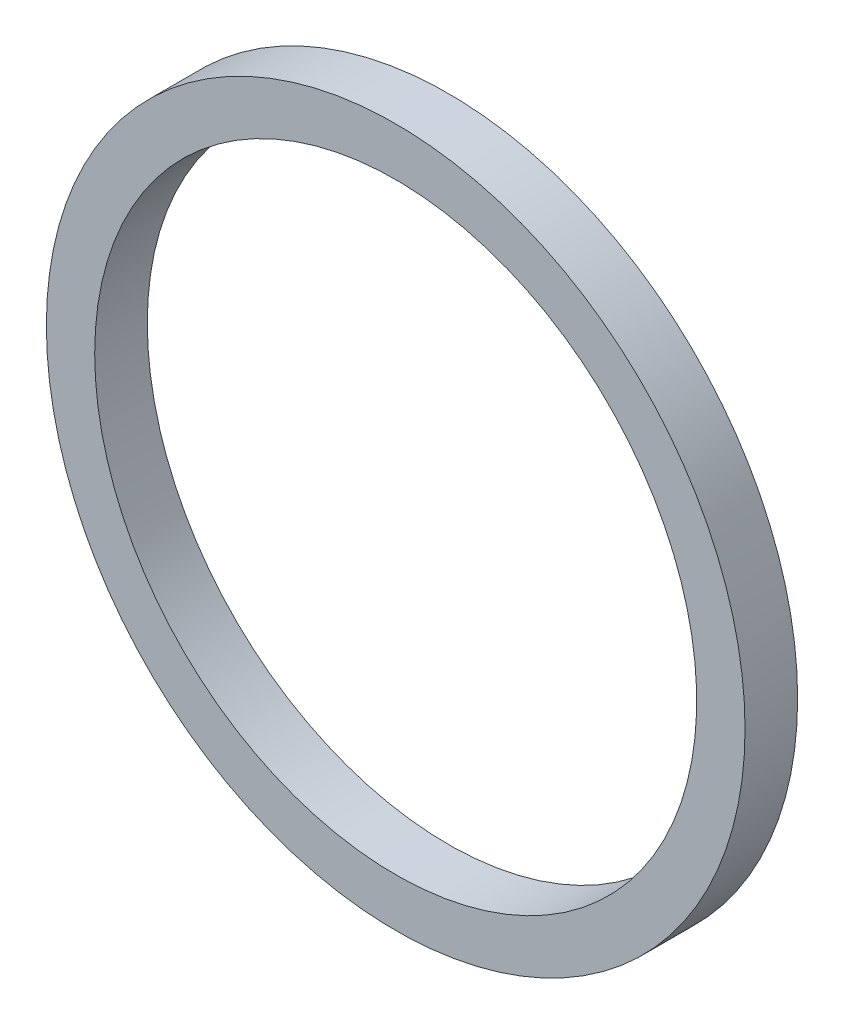
ISO-10303-21;
HEADER;
FILE_DESCRIPTION(('STEP AP214'),'2;1');
FILE_NAME('part.step','',(''),(''),'','','');
FILE_SCHEMA(('AUTOMOTIVE_DESIGN { 1 0 10303 214 1 1 1 1 }'));
ENDSEC;
DATA;
#1=APPLICATION_CONTEXT('core data for automotive mechanical design processes');
#2=APPLICATION_PROTOCOL_DEFINITION('international standard','automotive_design',2000,#1);
#3=PRODUCT_CONTEXT('',#1,'mechanical');
#4=PRODUCT('Part','Part','',(#3));
#5=PRODUCT_RELATED_PRODUCT_CATEGORY('part','',(#4));
#6=PRODUCT_DEFINITION_FORMATION('','',#4);
#7=PRODUCT_DEFINITION_CONTEXT('part definition',#1,'design');
#8=PRODUCT_DEFINITION('design','',#6,#7);
#9=PRODUCT_DEFINITION_SHAPE('','',#8);
#10=(LENGTH_UNIT() NAMED_UNIT(*) SI_UNIT(.MILLI.,.METRE.));
#11=(NAMED_UNIT(*) PLANE_ANGLE_UNIT() SI_UNIT($,.RADIAN.));
#12=(NAMED_UNIT(*) SI_UNIT($,.STERADIAN.) SOLID_ANGLE_UNIT());
#13=UNCERTAINTY_MEASURE_WITH_UNIT(LENGTH_MEASURE(1.E-05),#10,'distance_accuracy_value','');
#14=(GEOMETRIC_REPRESENTATION_CONTEXT(3) GLOBAL_UNCERTAINTY_ASSIGNED_CONTEXT((#13)) GLOBAL_UNIT_ASSIGNED_CONTEXT((#10,
#11,#12)) REPRESENTATION_CONTEXT('',''));
#15=CARTESIAN_POINT('',(0.,0.,0.));
#16=DIRECTION('',(0.,0.,1.));
#17=DIRECTION('',(1.,0.,0.));
#18=AXIS2_PLACEMENT_3D('',#15,#16,#17);
#19=CARTESIAN_POINT('',(0.,0.,3.32));
#20=DIRECTION('',(0.,0.,1.));
#21=DIRECTION('',(1.,0.,0.));
#22=AXIS2_PLACEMENT_3D('',#19,#20,#21);
#23=PLANE('',#22);
#24=CARTESIAN_POINT('',(0.,0.,3.32));
#25=DIRECTION('',(0.,0.,1.));
#26=DIRECTION('',(1.,0.,0.));
#27=AXIS2_PLACEMENT_3D('',#24,#25,#26);
#28=CIRCLE('',#27,22.05);
#29=CARTESIAN_POINT('',(-22.05,0.,3.32));
#30=VERTEX_POINT('',#29);
#31=EDGE_CURVE('E10',#30,#30,#28,.T.);
#32=ORIENTED_EDGE('',*,*,#31,.T.);
#33=EDGE_LOOP('',(#32));
#34=FACE_BOUND('',#33,.T.);
#35=CARTESIAN_POINT('',(0.,0.,3.32));
#36=DIRECTION('',(0.,0.,1.));
#37=DIRECTION('',(1.,0.,0.));
#38=AXIS2_PLACEMENT_3D('',#35,#36,#37);
#39=CIRCLE('',#38,19.);
#40=CARTESIAN_POINT('',(-19.,0.,3.32));
#41=VERTEX_POINT('',#40);
#42=EDGE_CURVE('E51',#41,#41,#39,.T.);
#43=ORIENTED_EDGE('',*,*,#42,.F.);
#44=EDGE_LOOP('',(#43));
#45=FACE_BOUND('',#44,.T.);
#46=ADVANCED_FACE('F38',(#34,#45),#23,.T.);
#47=CARTESIAN_POINT('',(0.,0.,0.));
#48=DIRECTION('',(0.,0.,1.));
#49=DIRECTION('',(1.,0.,0.));
#50=AXIS2_PLACEMENT_3D('',#47,#48,#49);
#51=PLANE('',#50);
#52=CARTESIAN_POINT('',(0.,0.,0.));
#53=DIRECTION('',(0.,0.,1.));
#54=DIRECTION('',(1.,0.,0.));
#55=AXIS2_PLACEMENT_3D('',#52,#53,#54);
#56=CIRCLE('',#55,22.05);
#57=CARTESIAN_POINT('',(-22.05,0.,0.));
#58=VERTEX_POINT('',#57);
#59=EDGE_CURVE('E42',#58,#58,#56,.T.);
#60=ORIENTED_EDGE('',*,*,#59,.F.);
#61=EDGE_LOOP('',(#60));
#62=FACE_BOUND('',#61,.T.);
#63=CARTESIAN_POINT('',(0.,0.,0.));
#64=DIRECTION('',(0.,0.,1.));
#65=DIRECTION('',(1.,0.,0.));
#66=AXIS2_PLACEMENT_3D('',#63,#64,#65);
#67=CIRCLE('',#66,19.);
#68=CARTESIAN_POINT('',(-19.,0.,0.));
#69=VERTEX_POINT('',#68);
#70=EDGE_CURVE('E53',#69,#69,#67,.T.);
#71=ORIENTED_EDGE('',*,*,#70,.T.);
#72=EDGE_LOOP('',(#71));
#73=FACE_BOUND('',#72,.T.);
#74=ADVANCED_FACE('F65',(#62,#73),#51,.F.);
#75=CARTESIAN_POINT('',(0.,0.,3.32));
#76=DIRECTION('',(0.,0.,-1.));
#77=DIRECTION('',(-1.,0.,0.));
#78=AXIS2_PLACEMENT_3D('',#75,#76,#77);
#79=CYLINDRICAL_SURFACE('',#78,22.05);
#80=CARTESIAN_POINT('',(-22.05,0.,3.32));
#81=CARTESIAN_POINT('',(-22.05,0.,3.28541666666667));
#82=CARTESIAN_POINT('',(-22.05,0.,3.25083333333333));
#83=CARTESIAN_POINT('',(-22.05,0.,3.18166666666667));
#84=CARTESIAN_POINT('',(-22.05,0.,3.14708333333333));
#85=CARTESIAN_POINT('',(-22.05,0.,3.07791666666667));
#86=CARTESIAN_POINT('',(-22.05,0.,3.04333333333333));
#87=CARTESIAN_POINT('',(-22.05,0.,2.97416666666667));
#88=CARTESIAN_POINT('',(-22.05,0.,2.93958333333333));
#89=CARTESIAN_POINT('',(-22.05,0.,2.87041666666667));
#90=CARTESIAN_POINT('',(-22.05,0.,2.83583333333333));
#91=CARTESIAN_POINT('',(-22.05,0.,2.76666666666667));
#92=CARTESIAN_POINT('',(-22.05,0.,2.73208333333333));
#93=CARTESIAN_POINT('',(-22.05,0.,2.66291666666667));
#94=CARTESIAN_POINT('',(-22.05,0.,2.62833333333333));
#95=CARTESIAN_POINT('',(-22.05,0.,2.55916666666667));
#96=CARTESIAN_POINT('',(-22.05,0.,2.52458333333333));
#97=CARTESIAN_POINT('',(-22.05,0.,2.45541666666667));
#98=CARTESIAN_POINT('',(-22.05,0.,2.42083333333333));
#99=CARTESIAN_POINT('',(-22.05,0.,2.35166666666667));
#100=CARTESIAN_POINT('',(-22.05,0.,2.31708333333333));
#101=CARTESIAN_POINT('',(-22.05,0.,2.24791666666667));
#102=CARTESIAN_POINT('',(-22.05,0.,2.21333333333333));
#103=CARTESIAN_POINT('',(-22.05,0.,2.14416666666667));
#104=CARTESIAN_POINT('',(-22.05,0.,2.10958333333333));
#105=CARTESIAN_POINT('',(-22.05,0.,2.04041666666667));
#106=CARTESIAN_POINT('',(-22.05,0.,2.00583333333333));
#107=CARTESIAN_POINT('',(-22.05,0.,1.93666666666667));
#108=CARTESIAN_POINT('',(-22.05,0.,1.90208333333333));
#109=CARTESIAN_POINT('',(-22.05,0.,1.83291666666667));
#110=CARTESIAN_POINT('',(-22.05,0.,1.79833333333333));
#111=CARTESIAN_POINT('',(-22.05,0.,1.72916666666667));
#112=CARTESIAN_POINT('',(-22.05,0.,1.69458333333333));
#113=CARTESIAN_POINT('',(-22.05,0.,1.62541666666667));
#114=CARTESIAN_POINT('',(-22.05,0.,1.59083333333333));
#115=CARTESIAN_POINT('',(-22.05,0.,1.52166666666667));
#116=CARTESIAN_POINT('',(-22.05,0.,1.48708333333333));
#117=CARTESIAN_POINT('',(-22.05,0.,1.41791666666667));
#118=CARTESIAN_POINT('',(-22.05,0.,1.38333333333333));
#119=CARTESIAN_POINT('',(-22.05,0.,1.31416666666667));
#120=CARTESIAN_POINT('',(-22.05,0.,1.27958333333333));
#121=CARTESIAN_POINT('',(-22.05,0.,1.21041666666667));
#122=CARTESIAN_POINT('',(-22.05,0.,1.17583333333333));
#123=CARTESIAN_POINT('',(-22.05,0.,1.10666666666667));
#124=CARTESIAN_POINT('',(-22.05,0.,1.07208333333333));
#125=CARTESIAN_POINT('',(-22.05,0.,1.00291666666667));
#126=CARTESIAN_POINT('',(-22.05,0.,0.968333333333333));
#127=CARTESIAN_POINT('',(-22.05,0.,0.899166666666666));
#128=CARTESIAN_POINT('',(-22.05,0.,0.864583333333333));
#129=CARTESIAN_POINT('',(-22.05,0.,0.795416666666666));
#130=CARTESIAN_POINT('',(-22.05,0.,0.760833333333333));
#131=CARTESIAN_POINT('',(-22.05,0.,0.691666666666667));
#132=CARTESIAN_POINT('',(-22.05,0.,0.657083333333333));
#133=CARTESIAN_POINT('',(-22.05,0.,0.587916666666666));
#134=CARTESIAN_POINT('',(-22.05,0.,0.553333333333333));
#135=CARTESIAN_POINT('',(-22.05,0.,0.484166666666666));
#136=CARTESIAN_POINT('',(-22.05,0.,0.449583333333333));
#137=CARTESIAN_POINT('',(-22.05,0.,0.380416666666666));
#138=CARTESIAN_POINT('',(-22.05,0.,0.345833333333333));
#139=CARTESIAN_POINT('',(-22.05,0.,0.276666666666666));
#140=CARTESIAN_POINT('',(-22.05,0.,0.242083333333333));
#141=CARTESIAN_POINT('',(-22.05,0.,0.172916666666666));
#142=CARTESIAN_POINT('',(-22.05,0.,0.138333333333333));
#143=CARTESIAN_POINT('',(-22.05,0.,0.0691666666666663));
#144=CARTESIAN_POINT('',(-22.05,0.,0.0345833333333329));
#145=CARTESIAN_POINT('',(-22.05,0.,0.));
#146=B_SPLINE_CURVE_WITH_KNOTS('',3,(#80,#81,#82,#83,#84,#85,#86,#87,#88,#89,#90,#91,#92,#93,
#94,#95,#96,#97,#98,#99,#100,#101,#102,#103,#104,#105,#106,#107,#108,#109,#110,#111,#112,#113,
#114,#115,#116,#117,#118,#119,#120,#121,#122,#123,#124,#125,#126,#127,#128,#129,#130,#131,#132,
#133,#134,#135,#136,#137,#138,#139,#140,#141,#142,#143,#144,#145),.UNSPECIFIED.,.F.,.F.,(4,2,2,
2,2,2,2,2,2,2,2,2,2,2,2,2,2,2,2,2,2,2,2,2,2,2,2,2,2,2,2,2,4),(0.,0.10375,0.2075,0.31125,0.415,
0.51875,0.6225,0.72625,0.83,0.933750000000001,1.0375,1.14125,1.245,1.34875,1.4525,1.55625,1.66,
1.76375,1.8675,1.97125,2.075,2.17875,2.2825,2.38625,2.49,2.59375,2.6975,2.80125,2.905,3.00875,
3.1125,3.21625,3.32),.UNSPECIFIED.);
#147=EDGE_CURVE('BSEAM40',#30,#58,#146,.T.);
#148=ORIENTED_EDGE('',*,*,#31,.F.);
#149=ORIENTED_EDGE('',*,*,#59,.T.);
#150=ORIENTED_EDGE('',*,*,#147,.T.);
#151=ORIENTED_EDGE('',*,*,#147,.F.);
#152=EDGE_LOOP('',(#148,#150,#149,#151));
#153=FACE_BOUND('',#152,.T.);
#154=ADVANCED_FACE('F40',(#153),#79,.T.);
#155=CARTESIAN_POINT('',(0.,0.,3.32));
#156=DIRECTION('',(0.,0.,-1.));
#157=DIRECTION('',(-1.,0.,0.));
#158=AXIS2_PLACEMENT_3D('',#155,#156,#157);
#159=CYLINDRICAL_SURFACE('',#158,19.);
#160=CARTESIAN_POINT('',(-19.,0.,3.32));
#161=CARTESIAN_POINT('',(-19.,0.,3.28541666666667));
#162=CARTESIAN_POINT('',(-19.,0.,3.25083333333333));
#163=CARTESIAN_POINT('',(-19.,0.,3.18166666666667));
#164=CARTESIAN_POINT('',(-19.,0.,3.14708333333333));
#165=CARTESIAN_POINT('',(-19.,0.,3.07791666666667));
#166=CARTESIAN_POINT('',(-19.,0.,3.04333333333333));
#167=CARTESIAN_POINT('',(-19.,0.,2.97416666666667));
#168=CARTESIAN_POINT('',(-19.,0.,2.93958333333333));
#169=CARTESIAN_POINT('',(-19.,0.,2.87041666666667));
#170=CARTESIAN_POINT('',(-19.,0.,2.83583333333333));
#171=CARTESIAN_POINT('',(-19.,0.,2.76666666666667));
#172=CARTESIAN_POINT('',(-19.,0.,2.73208333333333));
#173=CARTESIAN_POINT('',(-19.,0.,2.66291666666667));
#174=CARTESIAN_POINT('',(-19.,0.,2.62833333333333));
#175=CARTESIAN_POINT('',(-19.,0.,2.55916666666667));
#176=CARTESIAN_POINT('',(-19.,0.,2.52458333333333));
#177=CARTESIAN_POINT('',(-19.,0.,2.45541666666667));
#178=CARTESIAN_POINT('',(-19.,0.,2.42083333333333));
#179=CARTESIAN_POINT('',(-19.,0.,2.35166666666667));
#180=CARTESIAN_POINT('',(-19.,0.,2.31708333333333));
#181=CARTESIAN_POINT('',(-19.,0.,2.24791666666667));
#182=CARTESIAN_POINT('',(-19.,0.,2.21333333333333));
#183=CARTESIAN_POINT('',(-19.,0.,2.14416666666667));
#184=CARTESIAN_POINT('',(-19.,0.,2.10958333333333));
#185=CARTESIAN_POINT('',(-19.,0.,2.04041666666667));
#186=CARTESIAN_POINT('',(-19.,0.,2.00583333333333));
#187=CARTESIAN_POINT('',(-19.,0.,1.93666666666667));
#188=CARTESIAN_POINT('',(-19.,0.,1.90208333333333));
#189=CARTESIAN_POINT('',(-19.,0.,1.83291666666667));
#190=CARTESIAN_POINT('',(-19.,0.,1.79833333333333));
#191=CARTESIAN_POINT('',(-19.,0.,1.72916666666667));
#192=CARTESIAN_POINT('',(-19.,0.,1.69458333333333));
#193=CARTESIAN_POINT('',(-19.,0.,1.62541666666667));
#194=CARTESIAN_POINT('',(-19.,0.,1.59083333333333));
#195=CARTESIAN_POINT('',(-19.,0.,1.52166666666667));
#196=CARTESIAN_POINT('',(-19.,0.,1.48708333333333));
#197=CARTESIAN_POINT('',(-19.,0.,1.41791666666667));
#198=CARTESIAN_POINT('',(-19.,0.,1.38333333333333));
#199=CARTESIAN_POINT('',(-19.,0.,1.31416666666667));
#200=CARTESIAN_POINT('',(-19.,0.,1.27958333333333));
#201=CARTESIAN_POINT('',(-19.,0.,1.21041666666667));
#202=CARTESIAN_POINT('',(-19.,0.,1.17583333333333));
#203=CARTESIAN_POINT('',(-19.,0.,1.10666666666667));
#204=CARTESIAN_POINT('',(-19.,0.,1.07208333333333));
#205=CARTESIAN_POINT('',(-19.,0.,1.00291666666667));
#206=CARTESIAN_POINT('',(-19.,0.,0.968333333333333));
#207=CARTESIAN_POINT('',(-19.,0.,0.899166666666666));
#208=CARTESIAN_POINT('',(-19.,0.,0.864583333333333));
#209=CARTESIAN_POINT('',(-19.,0.,0.795416666666666));
#210=CARTESIAN_POINT('',(-19.,0.,0.760833333333333));
#211=CARTESIAN_POINT('',(-19.,0.,0.691666666666667));
#212=CARTESIAN_POINT('',(-19.,0.,0.657083333333333));
#213=CARTESIAN_POINT('',(-19.,0.,0.587916666666666));
#214=CARTESIAN_POINT('',(-19.,0.,0.553333333333333));
#215=CARTESIAN_POINT('',(-19.,0.,0.484166666666666));
#216=CARTESIAN_POINT('',(-19.,0.,0.449583333333333));
#217=CARTESIAN_POINT('',(-19.,0.,0.380416666666666));
#218=CARTESIAN_POINT('',(-19.,0.,0.345833333333333));
#219=CARTESIAN_POINT('',(-19.,0.,0.276666666666666));
#220=CARTESIAN_POINT('',(-19.,0.,0.242083333333333));
#221=CARTESIAN_POINT('',(-19.,0.,0.172916666666666));
#222=CARTESIAN_POINT('',(-19.,0.,0.138333333333333));
#223=CARTESIAN_POINT('',(-19.,0.,0.0691666666666663));
#224=CARTESIAN_POINT('',(-19.,0.,0.0345833333333329));
#225=CARTESIAN_POINT('',(-19.,0.,0.));
#226=B_SPLINE_CURVE_WITH_KNOTS('',3,(#160,#161,#162,#163,#164,#165,#166,#167,#168,#169,#170,
#171,#172,#173,#174,#175,#176,#177,#178,#179,#180,#181,#182,#183,#184,#185,#186,#187,#188,#189,
#190,#191,#192,#193,#194,#195,#196,#197,#198,#199,#200,#201,#202,#203,#204,#205,#206,#207,#208,
#209,#210,#211,#212,#213,#214,#215,#216,#217,#218,#219,#220,#221,#222,#223,#224,#225),
.UNSPECIFIED.,.F.,.F.,(4,2,2,2,2,2,2,2,2,2,2,2,2,2,2,2,2,2,2,2,2,2,2,2,2,2,2,2,2,2,2,2,4),(0.,
0.10375,0.2075,0.31125,0.415,0.51875,0.6225,0.72625,0.83,0.933750000000001,1.0375,1.14125,1.245,
1.34875,1.4525,1.55625,1.66,1.76375,1.8675,1.97125,2.075,2.17875,2.2825,2.38625,2.49,2.59375,
2.6975,2.80125,2.905,3.00875,3.1125,3.21625,3.32),.UNSPECIFIED.);
#227=EDGE_CURVE('BSEAM61',#41,#69,#226,.T.);
#228=ORIENTED_EDGE('',*,*,#42,.T.);
#229=ORIENTED_EDGE('',*,*,#70,.F.);
#230=ORIENTED_EDGE('',*,*,#227,.T.);
#231=ORIENTED_EDGE('',*,*,#227,.F.);
#232=EDGE_LOOP('',(#228,#230,#229,#231));
#233=FACE_BOUND('',#232,.T.);
#234=ADVANCED_FACE('F61',(#233),#159,.F.);
#235=CLOSED_SHELL('',(#46,#74,#154,#234));
#236=MANIFOLD_SOLID_BREP('B2',#235);
#237=ADVANCED_BREP_SHAPE_REPRESENTATION('',(#18,#236),#14);
#238=SHAPE_DEFINITION_REPRESENTATION(#9,#237);
ENDSEC;
END-ISO-10303-21;
